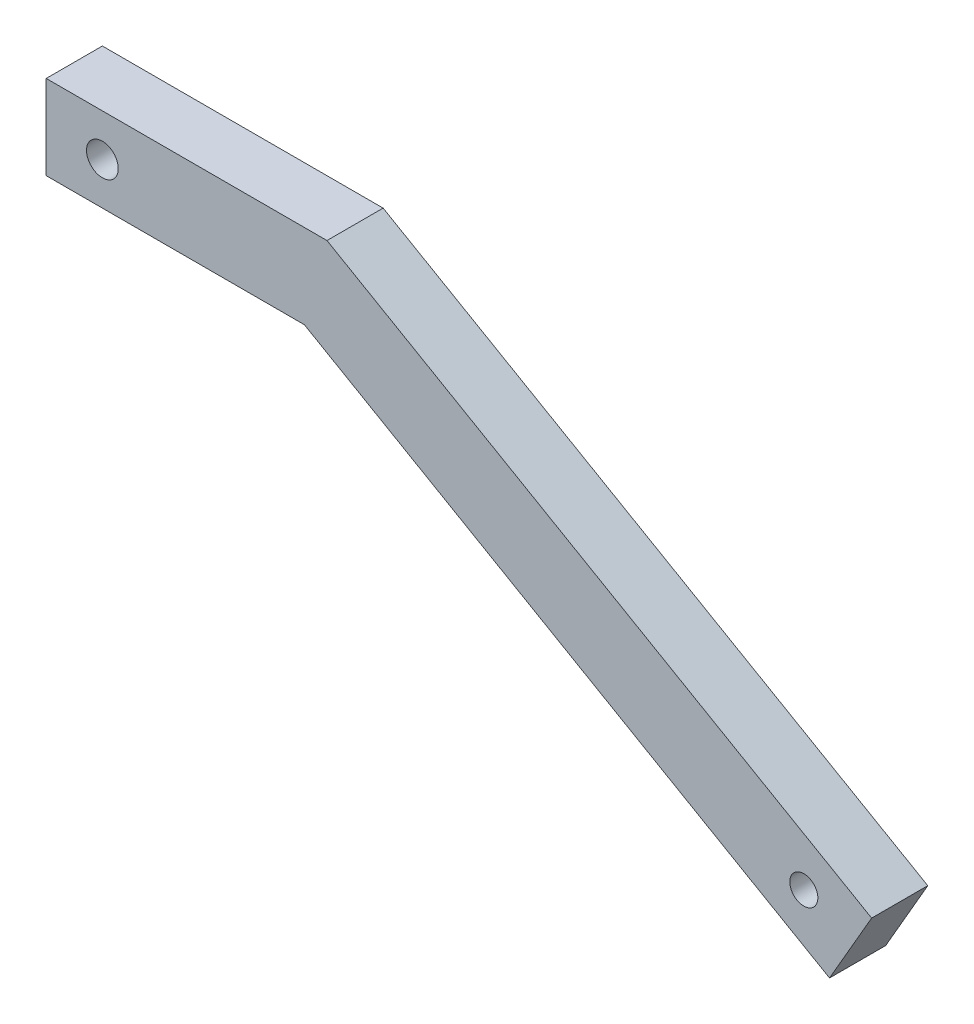
ISO-10303-21;
HEADER;
FILE_DESCRIPTION(('STEP AP214'),'2;1');
FILE_NAME('part.step','',(''),(''),'','','');
FILE_SCHEMA(('AUTOMOTIVE_DESIGN { 1 0 10303 214 1 1 1 1 }'));
ENDSEC;
DATA;
#1=APPLICATION_CONTEXT('core data for automotive mechanical design processes');
#2=APPLICATION_PROTOCOL_DEFINITION('international standard','automotive_design',2000,#1);
#3=PRODUCT_CONTEXT('',#1,'mechanical');
#4=PRODUCT('Part','Part','',(#3));
#5=PRODUCT_RELATED_PRODUCT_CATEGORY('part','',(#4));
#6=PRODUCT_DEFINITION_FORMATION('','',#4);
#7=PRODUCT_DEFINITION_CONTEXT('part definition',#1,'design');
#8=PRODUCT_DEFINITION('design','',#6,#7);
#9=PRODUCT_DEFINITION_SHAPE('','',#8);
#10=(LENGTH_UNIT() NAMED_UNIT(*) SI_UNIT(.MILLI.,.METRE.));
#11=(NAMED_UNIT(*) PLANE_ANGLE_UNIT() SI_UNIT($,.RADIAN.));
#12=(NAMED_UNIT(*) SI_UNIT($,.STERADIAN.) SOLID_ANGLE_UNIT());
#13=UNCERTAINTY_MEASURE_WITH_UNIT(LENGTH_MEASURE(1.E-05),#10,'distance_accuracy_value','');
#14=(GEOMETRIC_REPRESENTATION_CONTEXT(3) GLOBAL_UNCERTAINTY_ASSIGNED_CONTEXT((#13)) GLOBAL_UNIT_ASSIGNED_CONTEXT((#10,
#11,#12)) REPRESENTATION_CONTEXT('',''));
#15=CARTESIAN_POINT('',(0.,0.,0.));
#16=DIRECTION('',(0.,0.,1.));
#17=DIRECTION('',(1.,0.,0.));
#18=AXIS2_PLACEMENT_3D('',#15,#16,#17);
#19=CARTESIAN_POINT('',(0.,-15.,-10.));
#20=DIRECTION('',(-1.,0.,0.));
#21=DIRECTION('',(0.,0.,1.));
#22=AXIS2_PLACEMENT_3D('',#19,#20,#21);
#23=PLANE('',#22);
#24=DIRECTION('',(0.,-1.,0.));
#25=VECTOR('',#24,1.);
#26=CARTESIAN_POINT('',(0.,-15.,0.));
#27=LINE('',#26,#25);
#28=CARTESIAN_POINT('',(0.,0.,0.));
#29=VERTEX_POINT('',#28);
#30=CARTESIAN_POINT('',(0.,-15.,0.));
#31=VERTEX_POINT('',#30);
#32=EDGE_CURVE('E124',#29,#31,#27,.T.);
#33=ORIENTED_EDGE('',*,*,#32,.F.);
#34=DIRECTION('',(0.,0.,1.));
#35=VECTOR('',#34,1.);
#36=CARTESIAN_POINT('',(0.,0.,-10.));
#37=LINE('',#36,#35);
#38=CARTESIAN_POINT('',(0.,0.,-10.));
#39=VERTEX_POINT('',#38);
#40=EDGE_CURVE('E11',#39,#29,#37,.T.);
#41=ORIENTED_EDGE('',*,*,#40,.F.);
#42=DIRECTION('',(0.,-1.,0.));
#43=VECTOR('',#42,1.);
#44=CARTESIAN_POINT('',(0.,-15.,-10.));
#45=LINE('',#44,#43);
#46=CARTESIAN_POINT('',(0.,-15.,-10.));
#47=VERTEX_POINT('',#46);
#48=EDGE_CURVE('E139',#39,#47,#45,.T.);
#49=ORIENTED_EDGE('',*,*,#48,.T.);
#50=DIRECTION('',(0.,0.,1.));
#51=VECTOR('',#50,1.);
#52=CARTESIAN_POINT('',(0.,-15.,-10.));
#53=LINE('',#52,#51);
#54=EDGE_CURVE('E42',#47,#31,#53,.T.);
#55=ORIENTED_EDGE('',*,*,#54,.T.);
#56=EDGE_LOOP('',(#33,#41,#49,#55));
#57=FACE_BOUND('',#56,.T.);
#58=ADVANCED_FACE('F39',(#57),#23,.T.);
#59=CARTESIAN_POINT('',(0.,0.,-10.));
#60=DIRECTION('',(0.,1.,0.));
#61=DIRECTION('',(-1.,0.,0.));
#62=AXIS2_PLACEMENT_3D('',#59,#60,#61);
#63=PLANE('',#62);
#64=DIRECTION('',(-1.,0.,0.));
#65=VECTOR('',#64,1.);
#66=CARTESIAN_POINT('',(0.,0.,0.));
#67=LINE('',#66,#65);
#68=CARTESIAN_POINT('',(50.,0.,0.));
#69=VERTEX_POINT('',#68);
#70=EDGE_CURVE('E137',#69,#29,#67,.T.);
#71=ORIENTED_EDGE('',*,*,#70,.F.);
#72=DIRECTION('',(0.,0.,1.));
#73=VECTOR('',#72,1.);
#74=CARTESIAN_POINT('',(50.,0.,-10.));
#75=LINE('',#74,#73);
#76=CARTESIAN_POINT('',(50.,0.,-10.));
#77=VERTEX_POINT('',#76);
#78=EDGE_CURVE('E48',#77,#69,#75,.T.);
#79=ORIENTED_EDGE('',*,*,#78,.F.);
#80=DIRECTION('',(-1.,0.,0.));
#81=VECTOR('',#80,1.);
#82=CARTESIAN_POINT('',(0.,0.,-10.));
#83=LINE('',#82,#81);
#84=EDGE_CURVE('E114',#77,#39,#83,.T.);
#85=ORIENTED_EDGE('',*,*,#84,.T.);
#86=ORIENTED_EDGE('',*,*,#40,.T.);
#87=EDGE_LOOP('',(#71,#79,#85,#86));
#88=FACE_BOUND('',#87,.T.);
#89=ADVANCED_FACE('F147',(#88),#63,.T.);
#90=CARTESIAN_POINT('',(50.,0.,-10.));
#91=DIRECTION('',(0.500000000000001,0.866025403784438,0.));
#92=DIRECTION('',(-0.866025403784438,0.500000000000001,0.));
#93=AXIS2_PLACEMENT_3D('',#90,#91,#92);
#94=PLANE('',#93);
#95=DIRECTION('',(-0.866025403784438,0.500000000000001,0.));
#96=VECTOR('',#95,1.);
#97=CARTESIAN_POINT('',(50.,0.,0.));
#98=LINE('',#97,#96);
#99=CARTESIAN_POINT('',(146.994845223857,-56.0000000000001,0.));
#100=VERTEX_POINT('',#99);
#101=EDGE_CURVE('E101',#100,#69,#98,.T.);
#102=ORIENTED_EDGE('',*,*,#101,.F.);
#103=DIRECTION('',(0.,0.,1.));
#104=VECTOR('',#103,1.);
#105=CARTESIAN_POINT('',(146.994845223857,-56.0000000000001,-10.));
#106=LINE('',#105,#104);
#107=CARTESIAN_POINT('',(146.994845223857,-56.0000000000001,-10.));
#108=VERTEX_POINT('',#107);
#109=EDGE_CURVE('E96',#108,#100,#106,.T.);
#110=ORIENTED_EDGE('',*,*,#109,.F.);
#111=DIRECTION('',(-0.866025403784438,0.500000000000001,0.));
#112=VECTOR('',#111,1.);
#113=CARTESIAN_POINT('',(50.,0.,-10.));
#114=LINE('',#113,#112);
#115=EDGE_CURVE('E99',#108,#77,#114,.T.);
#116=ORIENTED_EDGE('',*,*,#115,.T.);
#117=ORIENTED_EDGE('',*,*,#78,.T.);
#118=EDGE_LOOP('',(#102,#110,#116,#117));
#119=FACE_BOUND('',#118,.T.);
#120=ADVANCED_FACE('F98',(#119),#94,.T.);
#121=CARTESIAN_POINT('',(139.494845223857,-68.9903810567667,-10.));
#122=DIRECTION('',(0.866025403784438,-0.5,0.));
#123=DIRECTION('',(0.500000000000001,0.866025403784438,0.));
#124=AXIS2_PLACEMENT_3D('',#121,#122,#123);
#125=PLANE('',#124);
#126=DIRECTION('',(0.5,0.866025403784438,0.));
#127=VECTOR('',#126,1.);
#128=CARTESIAN_POINT('',(139.494845223857,-68.9903810567667,0.));
#129=LINE('',#128,#127);
#130=CARTESIAN_POINT('',(139.494845223857,-68.9903810567667,0.));
#131=VERTEX_POINT('',#130);
#132=EDGE_CURVE('E134',#131,#100,#129,.T.);
#133=ORIENTED_EDGE('',*,*,#132,.F.);
#134=DIRECTION('',(0.,0.,1.));
#135=VECTOR('',#134,1.);
#136=CARTESIAN_POINT('',(139.494845223857,-68.9903810567667,-10.));
#137=LINE('',#136,#135);
#138=CARTESIAN_POINT('',(139.494845223857,-68.9903810567667,-10.));
#139=VERTEX_POINT('',#138);
#140=EDGE_CURVE('E106',#139,#131,#137,.T.);
#141=ORIENTED_EDGE('',*,*,#140,.F.);
#142=DIRECTION('',(0.5,0.866025403784438,0.));
#143=VECTOR('',#142,1.);
#144=CARTESIAN_POINT('',(139.494845223857,-68.9903810567667,-10.));
#145=LINE('',#144,#143);
#146=EDGE_CURVE('E112',#139,#108,#145,.T.);
#147=ORIENTED_EDGE('',*,*,#146,.T.);
#148=ORIENTED_EDGE('',*,*,#109,.T.);
#149=EDGE_LOOP('',(#133,#141,#147,#148));
#150=FACE_BOUND('',#149,.T.);
#151=ADVANCED_FACE('F116',(#150),#125,.T.);
#152=CARTESIAN_POINT('',(45.9807621135332,-15.,-10.));
#153=DIRECTION('',(-0.500000000000001,-0.866025403784438,0.));
#154=DIRECTION('',(0.866025403784438,-0.500000000000001,0.));
#155=AXIS2_PLACEMENT_3D('',#152,#153,#154);
#156=PLANE('',#155);
#157=DIRECTION('',(0.866025403784438,-0.500000000000001,0.));
#158=VECTOR('',#157,1.);
#159=CARTESIAN_POINT('',(45.9807621135332,-15.,0.));
#160=LINE('',#159,#158);
#161=CARTESIAN_POINT('',(45.9807621135332,-15.,0.));
#162=VERTEX_POINT('',#161);
#163=EDGE_CURVE('E131',#162,#131,#160,.T.);
#164=ORIENTED_EDGE('',*,*,#163,.F.);
#165=DIRECTION('',(0.,0.,1.));
#166=VECTOR('',#165,1.);
#167=CARTESIAN_POINT('',(45.9807621135332,-15.,-10.));
#168=LINE('',#167,#166);
#169=CARTESIAN_POINT('',(45.9807621135332,-15.,-10.));
#170=VERTEX_POINT('',#169);
#171=EDGE_CURVE('E142',#170,#162,#168,.T.);
#172=ORIENTED_EDGE('',*,*,#171,.F.);
#173=DIRECTION('',(0.866025403784438,-0.500000000000001,0.));
#174=VECTOR('',#173,1.);
#175=CARTESIAN_POINT('',(45.9807621135332,-15.,-10.));
#176=LINE('',#175,#174);
#177=EDGE_CURVE('E117',#170,#139,#176,.T.);
#178=ORIENTED_EDGE('',*,*,#177,.T.);
#179=ORIENTED_EDGE('',*,*,#140,.T.);
#180=EDGE_LOOP('',(#164,#172,#178,#179));
#181=FACE_BOUND('',#180,.T.);
#182=ADVANCED_FACE('F160',(#181),#156,.T.);
#183=CARTESIAN_POINT('',(0.,-15.,-10.));
#184=DIRECTION('',(0.,-1.,0.));
#185=DIRECTION('',(0.,0.,-1.));
#186=AXIS2_PLACEMENT_3D('',#183,#184,#185);
#187=PLANE('',#186);
#188=DIRECTION('',(1.,0.,0.));
#189=VECTOR('',#188,1.);
#190=CARTESIAN_POINT('',(0.,-15.,0.));
#191=LINE('',#190,#189);
#192=EDGE_CURVE('E127',#31,#162,#191,.T.);
#193=ORIENTED_EDGE('',*,*,#192,.F.);
#194=ORIENTED_EDGE('',*,*,#54,.F.);
#195=DIRECTION('',(1.,0.,0.));
#196=VECTOR('',#195,1.);
#197=CARTESIAN_POINT('',(0.,-15.,-10.));
#198=LINE('',#197,#196);
#199=EDGE_CURVE('E119',#47,#170,#198,.T.);
#200=ORIENTED_EDGE('',*,*,#199,.T.);
#201=ORIENTED_EDGE('',*,*,#171,.T.);
#202=EDGE_LOOP('',(#193,#194,#200,#201));
#203=FACE_BOUND('',#202,.T.);
#204=ADVANCED_FACE('F144',(#203),#187,.T.);
#205=CARTESIAN_POINT('',(0.,0.,-10.));
#206=DIRECTION('',(0.,0.,-1.));
#207=DIRECTION('',(-1.,0.,0.));
#208=AXIS2_PLACEMENT_3D('',#205,#206,#207);
#209=PLANE('',#208);
#210=CARTESIAN_POINT('',(134.915511345677,-57.6862473716459,-10.));
#211=DIRECTION('',(0.,0.,-1.));
#212=DIRECTION('',(-1.,0.,0.));
#213=AXIS2_PLACEMENT_3D('',#210,#211,#212);
#214=CIRCLE('',#213,2.5);
#215=CARTESIAN_POINT('',(132.415511345677,-57.6862473716459,-10.));
#216=VERTEX_POINT('',#215);
#217=EDGE_CURVE('E186',#216,#216,#214,.F.);
#218=ORIENTED_EDGE('',*,*,#217,.T.);
#219=EDGE_LOOP('',(#218));
#220=FACE_BOUND('',#219,.T.);
#221=CARTESIAN_POINT('',(10.,-7.5,-10.));
#222=DIRECTION('',(0.,0.,-1.));
#223=DIRECTION('',(-1.,0.,0.));
#224=AXIS2_PLACEMENT_3D('',#221,#222,#223);
#225=CIRCLE('',#224,2.82367117322598);
#226=CARTESIAN_POINT('',(7.17632882677402,-7.5,-10.));
#227=VERTEX_POINT('',#226);
#228=EDGE_CURVE('E190',#227,#227,#225,.F.);
#229=ORIENTED_EDGE('',*,*,#228,.T.);
#230=EDGE_LOOP('',(#229));
#231=FACE_BOUND('',#230,.T.);
#232=ORIENTED_EDGE('',*,*,#48,.F.);
#233=ORIENTED_EDGE('',*,*,#84,.F.);
#234=ORIENTED_EDGE('',*,*,#115,.F.);
#235=ORIENTED_EDGE('',*,*,#146,.F.);
#236=ORIENTED_EDGE('',*,*,#177,.F.);
#237=ORIENTED_EDGE('',*,*,#199,.F.);
#238=EDGE_LOOP('',(#232,#233,#234,#235,#236,#237));
#239=FACE_BOUND('',#238,.T.);
#240=ADVANCED_FACE('F110',(#220,#231,#239),#209,.T.);
#241=CARTESIAN_POINT('',(0.,0.,0.));
#242=DIRECTION('',(0.,0.,-1.));
#243=DIRECTION('',(-1.,0.,0.));
#244=AXIS2_PLACEMENT_3D('',#241,#242,#243);
#245=PLANE('',#244);
#246=CARTESIAN_POINT('',(134.915511345677,-57.6862473716459,0.));
#247=DIRECTION('',(0.,0.,1.));
#248=DIRECTION('',(1.,0.,0.));
#249=AXIS2_PLACEMENT_3D('',#246,#247,#248);
#250=CIRCLE('',#249,2.5);
#251=CARTESIAN_POINT('',(137.415511345677,-57.6862473716459,0.));
#252=VERTEX_POINT('',#251);
#253=EDGE_CURVE('E189',#252,#252,#250,.T.);
#254=ORIENTED_EDGE('',*,*,#253,.F.);
#255=EDGE_LOOP('',(#254));
#256=FACE_BOUND('',#255,.T.);
#257=CARTESIAN_POINT('',(10.,-7.5,0.));
#258=DIRECTION('',(0.,0.,1.));
#259=DIRECTION('',(1.,0.,0.));
#260=AXIS2_PLACEMENT_3D('',#257,#258,#259);
#261=CIRCLE('',#260,2.82367117322598);
#262=CARTESIAN_POINT('',(12.823671173226,-7.5,0.));
#263=VERTEX_POINT('',#262);
#264=EDGE_CURVE('E128',#263,#263,#261,.T.);
#265=ORIENTED_EDGE('',*,*,#264,.F.);
#266=EDGE_LOOP('',(#265));
#267=FACE_BOUND('',#266,.T.);
#268=ORIENTED_EDGE('',*,*,#32,.T.);
#269=ORIENTED_EDGE('',*,*,#192,.T.);
#270=ORIENTED_EDGE('',*,*,#163,.T.);
#271=ORIENTED_EDGE('',*,*,#132,.T.);
#272=ORIENTED_EDGE('',*,*,#101,.T.);
#273=ORIENTED_EDGE('',*,*,#70,.T.);
#274=EDGE_LOOP('',(#268,#269,#270,#271,#272,#273));
#275=FACE_BOUND('',#274,.T.);
#276=ADVANCED_FACE('F146',(#256,#267,#275),#245,.F.);
#277=CARTESIAN_POINT('',(10.,-7.5,-10.001));
#278=DIRECTION('',(0.,0.,1.));
#279=DIRECTION('',(1.,0.,0.));
#280=AXIS2_PLACEMENT_3D('',#277,#278,#279);
#281=CYLINDRICAL_SURFACE('',#280,2.82367117322598);
#282=ORIENTED_EDGE('',*,*,#228,.F.);
#283=EDGE_LOOP('',(#282));
#284=FACE_BOUND('',#283,.T.);
#285=ORIENTED_EDGE('',*,*,#264,.T.);
#286=EDGE_LOOP('',(#285));
#287=FACE_BOUND('',#286,.T.);
#288=ADVANCED_FACE('F171',(#284,#287),#281,.F.);
#289=CARTESIAN_POINT('',(134.915511345677,-57.6862473716459,-10.001));
#290=DIRECTION('',(0.,0.,1.));
#291=DIRECTION('',(1.,0.,0.));
#292=AXIS2_PLACEMENT_3D('',#289,#290,#291);
#293=CYLINDRICAL_SURFACE('',#292,2.5);
#294=ORIENTED_EDGE('',*,*,#217,.F.);
#295=EDGE_LOOP('',(#294));
#296=FACE_BOUND('',#295,.T.);
#297=ORIENTED_EDGE('',*,*,#253,.T.);
#298=EDGE_LOOP('',(#297));
#299=FACE_BOUND('',#298,.T.);
#300=ADVANCED_FACE('F178',(#296,#299),#293,.F.);
#301=CLOSED_SHELL('',(#58,#89,#120,#151,#182,#204,#240,#276,#288,#300));
#302=MANIFOLD_SOLID_BREP('B2',#301);
#303=ADVANCED_BREP_SHAPE_REPRESENTATION('',(#18,#302),#14);
#304=SHAPE_DEFINITION_REPRESENTATION(#9,#303);
ENDSEC;
END-ISO-10303-21;
